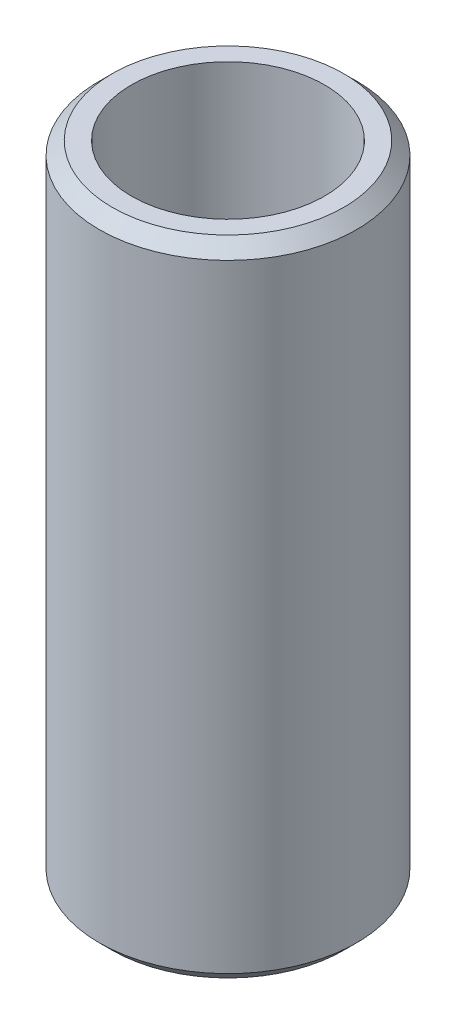
ISO-10303-21;
HEADER;
FILE_DESCRIPTION(('STEP AP214'),'2;1');
FILE_NAME('part.step','',(''),(''),'','','');
FILE_SCHEMA(('AUTOMOTIVE_DESIGN { 1 0 10303 214 1 1 1 1 }'));
ENDSEC;
DATA;
#1=APPLICATION_CONTEXT('core data for automotive mechanical design processes');
#2=APPLICATION_PROTOCOL_DEFINITION('international standard','automotive_design',2000,#1);
#3=PRODUCT_CONTEXT('',#1,'mechanical');
#4=PRODUCT('Part','Part','',(#3));
#5=PRODUCT_RELATED_PRODUCT_CATEGORY('part','',(#4));
#6=PRODUCT_DEFINITION_FORMATION('','',#4);
#7=PRODUCT_DEFINITION_CONTEXT('part definition',#1,'design');
#8=PRODUCT_DEFINITION('design','',#6,#7);
#9=PRODUCT_DEFINITION_SHAPE('','',#8);
#10=(LENGTH_UNIT() NAMED_UNIT(*) SI_UNIT(.MILLI.,.METRE.));
#11=(NAMED_UNIT(*) PLANE_ANGLE_UNIT() SI_UNIT($,.RADIAN.));
#12=(NAMED_UNIT(*) SI_UNIT($,.STERADIAN.) SOLID_ANGLE_UNIT());
#13=UNCERTAINTY_MEASURE_WITH_UNIT(LENGTH_MEASURE(1.E-05),#10,'distance_accuracy_value','');
#14=(GEOMETRIC_REPRESENTATION_CONTEXT(3) GLOBAL_UNCERTAINTY_ASSIGNED_CONTEXT((#13)) GLOBAL_UNIT_ASSIGNED_CONTEXT((#10,
#11,#12)) REPRESENTATION_CONTEXT('',''));
#15=CARTESIAN_POINT('',(0.,0.,0.));
#16=DIRECTION('',(0.,0.,1.));
#17=DIRECTION('',(1.,0.,0.));
#18=AXIS2_PLACEMENT_3D('',#15,#16,#17);
#19=CARTESIAN_POINT('',(0.,20.,0.));
#20=DIRECTION('',(0.,1.,0.));
#21=DIRECTION('',(0.,0.,1.));
#22=AXIS2_PLACEMENT_3D('',#19,#20,#21);
#23=PLANE('',#22);
#24=CARTESIAN_POINT('',(0.,20.,0.));
#25=DIRECTION('',(0.,1.,0.));
#26=DIRECTION('',(0.,0.,1.));
#27=AXIS2_PLACEMENT_3D('',#24,#25,#26);
#28=CIRCLE('',#27,3.6);
#29=CARTESIAN_POINT('',(0.,20.,3.6));
#30=VERTEX_POINT('',#29);
#31=EDGE_CURVE('E10',#30,#30,#28,.T.);
#32=ORIENTED_EDGE('',*,*,#31,.T.);
#33=EDGE_LOOP('',(#32));
#34=FACE_BOUND('',#33,.T.);
#35=CARTESIAN_POINT('',(0.,20.,0.));
#36=DIRECTION('',(0.,1.,0.));
#37=DIRECTION('',(0.,0.,1.));
#38=AXIS2_PLACEMENT_3D('',#35,#36,#37);
#39=CIRCLE('',#38,3.);
#40=CARTESIAN_POINT('',(0.,20.,3.));
#41=VERTEX_POINT('',#40);
#42=EDGE_CURVE('E54',#41,#41,#39,.T.);
#43=ORIENTED_EDGE('',*,*,#42,.F.);
#44=EDGE_LOOP('',(#43));
#45=FACE_BOUND('',#44,.T.);
#46=ADVANCED_FACE('F33',(#34,#45),#23,.T.);
#47=CARTESIAN_POINT('',(0.,0.,0.));
#48=DIRECTION('',(0.,1.,0.));
#49=DIRECTION('',(0.,0.,1.));
#50=AXIS2_PLACEMENT_3D('',#47,#48,#49);
#51=PLANE('',#50);
#52=CARTESIAN_POINT('',(0.,0.,0.));
#53=DIRECTION('',(0.,1.,0.));
#54=DIRECTION('',(0.,0.,1.));
#55=AXIS2_PLACEMENT_3D('',#52,#53,#54);
#56=CIRCLE('',#55,3.6);
#57=CARTESIAN_POINT('',(0.,0.,3.6));
#58=VERTEX_POINT('',#57);
#59=EDGE_CURVE('E41',#58,#58,#56,.F.);
#60=ORIENTED_EDGE('',*,*,#59,.T.);
#61=EDGE_LOOP('',(#60));
#62=FACE_BOUND('',#61,.T.);
#63=CARTESIAN_POINT('',(0.,0.,0.));
#64=DIRECTION('',(0.,1.,0.));
#65=DIRECTION('',(0.,0.,1.));
#66=AXIS2_PLACEMENT_3D('',#63,#64,#65);
#67=CIRCLE('',#66,3.);
#68=CARTESIAN_POINT('',(0.,0.,3.));
#69=VERTEX_POINT('',#68);
#70=EDGE_CURVE('E55',#69,#69,#67,.T.);
#71=ORIENTED_EDGE('',*,*,#70,.T.);
#72=EDGE_LOOP('',(#71));
#73=FACE_BOUND('',#72,.T.);
#74=ADVANCED_FACE('F65',(#62,#73),#51,.F.);
#75=CARTESIAN_POINT('',(0.,20.,0.));
#76=DIRECTION('',(0.,-1.,0.));
#77=DIRECTION('',(0.,0.,-1.));
#78=AXIS2_PLACEMENT_3D('',#75,#76,#77);
#79=CYLINDRICAL_SURFACE('',#78,4.);
#80=CARTESIAN_POINT('',(0.,0.400000000000001,0.));
#81=DIRECTION('',(0.,1.,0.));
#82=DIRECTION('',(0.,0.,1.));
#83=AXIS2_PLACEMENT_3D('',#80,#81,#82);
#84=CIRCLE('',#83,4.);
#85=CARTESIAN_POINT('',(0.,0.400000000000001,4.));
#86=VERTEX_POINT('',#85);
#87=EDGE_CURVE('E45',#86,#86,#84,.T.);
#88=ORIENTED_EDGE('',*,*,#87,.T.);
#89=EDGE_LOOP('',(#88));
#90=FACE_BOUND('',#89,.T.);
#91=CARTESIAN_POINT('',(0.,19.6,0.));
#92=DIRECTION('',(0.,1.,0.));
#93=DIRECTION('',(0.,0.,1.));
#94=AXIS2_PLACEMENT_3D('',#91,#92,#93);
#95=CIRCLE('',#94,4.);
#96=CARTESIAN_POINT('',(0.,19.6,4.));
#97=VERTEX_POINT('',#96);
#98=EDGE_CURVE('E49',#97,#97,#95,.F.);
#99=ORIENTED_EDGE('',*,*,#98,.T.);
#100=EDGE_LOOP('',(#99));
#101=FACE_BOUND('',#100,.T.);
#102=ADVANCED_FACE('F70',(#90,#101),#79,.T.);
#103=CARTESIAN_POINT('',(0.,20.,0.));
#104=DIRECTION('',(0.,-1.,0.));
#105=DIRECTION('',(0.,0.,-1.));
#106=AXIS2_PLACEMENT_3D('',#103,#104,#105);
#107=CYLINDRICAL_SURFACE('',#106,3.);
#108=ORIENTED_EDGE('',*,*,#42,.T.);
#109=EDGE_LOOP('',(#108));
#110=FACE_BOUND('',#109,.T.);
#111=ORIENTED_EDGE('',*,*,#70,.F.);
#112=EDGE_LOOP('',(#111));
#113=FACE_BOUND('',#112,.T.);
#114=ADVANCED_FACE('F61',(#110,#113),#107,.F.);
#115=CARTESIAN_POINT('',(0.,0.400000000000001,0.));
#116=DIRECTION('',(0.,1.,0.));
#117=DIRECTION('',(0.,0.,1.));
#118=AXIS2_PLACEMENT_3D('',#115,#116,#117);
#119=CONICAL_SURFACE('',#118,4.,0.78539816339745);
#120=ORIENTED_EDGE('',*,*,#59,.F.);
#121=EDGE_LOOP('',(#120));
#122=FACE_BOUND('',#121,.T.);
#123=ORIENTED_EDGE('',*,*,#87,.F.);
#124=EDGE_LOOP('',(#123));
#125=FACE_BOUND('',#124,.T.);
#126=ADVANCED_FACE('F77',(#122,#125),#119,.T.);
#127=CARTESIAN_POINT('',(0.,20.,0.));
#128=DIRECTION('',(0.,-1.,0.));
#129=DIRECTION('',(0.,0.,-1.));
#130=AXIS2_PLACEMENT_3D('',#127,#128,#129);
#131=CONICAL_SURFACE('',#130,3.6,0.785398163397448);
#132=ORIENTED_EDGE('',*,*,#98,.F.);
#133=EDGE_LOOP('',(#132));
#134=FACE_BOUND('',#133,.T.);
#135=ORIENTED_EDGE('',*,*,#31,.F.);
#136=EDGE_LOOP('',(#135));
#137=FACE_BOUND('',#136,.T.);
#138=ADVANCED_FACE('F36',(#134,#137),#131,.T.);
#139=CLOSED_SHELL('',(#46,#74,#102,#114,#126,#138));
#140=MANIFOLD_SOLID_BREP('B2',#139);
#141=ADVANCED_BREP_SHAPE_REPRESENTATION('',(#18,#140),#14);
#142=SHAPE_DEFINITION_REPRESENTATION(#9,#141);
ENDSEC;
END-ISO-10303-21;
